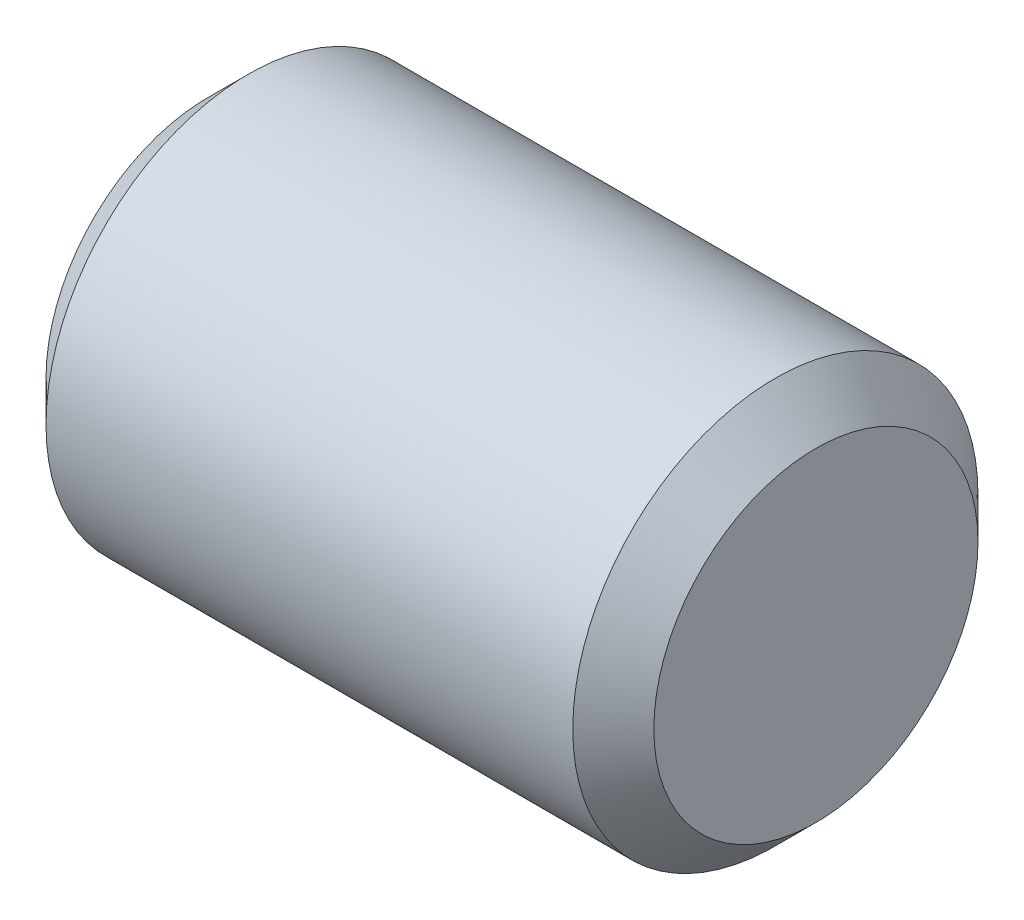
ISO-10303-21;
HEADER;
FILE_DESCRIPTION(('STEP AP214'),'2;1');
FILE_NAME('part.step','',(''),(''),'','','');
FILE_SCHEMA(('AUTOMOTIVE_DESIGN { 1 0 10303 214 1 1 1 1 }'));
ENDSEC;
DATA;
#1=APPLICATION_CONTEXT('core data for automotive mechanical design processes');
#2=APPLICATION_PROTOCOL_DEFINITION('international standard','automotive_design',2000,#1);
#3=PRODUCT_CONTEXT('',#1,'mechanical');
#4=PRODUCT('Part','Part','',(#3));
#5=PRODUCT_RELATED_PRODUCT_CATEGORY('part','',(#4));
#6=PRODUCT_DEFINITION_FORMATION('','',#4);
#7=PRODUCT_DEFINITION_CONTEXT('part definition',#1,'design');
#8=PRODUCT_DEFINITION('design','',#6,#7);
#9=PRODUCT_DEFINITION_SHAPE('','',#8);
#10=(LENGTH_UNIT() NAMED_UNIT(*) SI_UNIT(.MILLI.,.METRE.));
#11=(NAMED_UNIT(*) PLANE_ANGLE_UNIT() SI_UNIT($,.RADIAN.));
#12=(NAMED_UNIT(*) SI_UNIT($,.STERADIAN.) SOLID_ANGLE_UNIT());
#13=UNCERTAINTY_MEASURE_WITH_UNIT(LENGTH_MEASURE(1.E-05),#10,'distance_accuracy_value','');
#14=(GEOMETRIC_REPRESENTATION_CONTEXT(3) GLOBAL_UNCERTAINTY_ASSIGNED_CONTEXT((#13)) GLOBAL_UNIT_ASSIGNED_CONTEXT((#10,
#11,#12)) REPRESENTATION_CONTEXT('',''));
#15=CARTESIAN_POINT('',(0.,0.,0.));
#16=DIRECTION('',(0.,0.,1.));
#17=DIRECTION('',(1.,0.,0.));
#18=AXIS2_PLACEMENT_3D('',#15,#16,#17);
#19=CARTESIAN_POINT('',(-4.7625,0.,0.));
#20=DIRECTION('',(1.,0.,0.));
#21=DIRECTION('',(0.,0.,-1.));
#22=AXIS2_PLACEMENT_3D('',#19,#20,#21);
#23=CYLINDRICAL_SURFACE('',#22,3.175);
#24=CARTESIAN_POINT('',(4.1275,0.,0.));
#25=DIRECTION('',(1.,0.,0.));
#26=DIRECTION('',(0.,0.,-1.));
#27=AXIS2_PLACEMENT_3D('',#24,#25,#26);
#28=CIRCLE('',#27,3.175);
#29=CARTESIAN_POINT('',(4.1275,0.,-3.175));
#30=VERTEX_POINT('',#29);
#31=EDGE_CURVE('E37',#30,#30,#28,.F.);
#32=ORIENTED_EDGE('',*,*,#31,.T.);
#33=EDGE_LOOP('',(#32));
#34=FACE_BOUND('',#33,.T.);
#35=CARTESIAN_POINT('',(-4.1275,0.,0.));
#36=DIRECTION('',(1.,0.,0.));
#37=DIRECTION('',(0.,0.,-1.));
#38=AXIS2_PLACEMENT_3D('',#35,#36,#37);
#39=CIRCLE('',#38,3.175);
#40=CARTESIAN_POINT('',(-4.1275,0.,-3.175));
#41=VERTEX_POINT('',#40);
#42=EDGE_CURVE('E41',#41,#41,#39,.T.);
#43=ORIENTED_EDGE('',*,*,#42,.T.);
#44=EDGE_LOOP('',(#43));
#45=FACE_BOUND('',#44,.T.);
#46=ADVANCED_FACE('F30',(#34,#45),#23,.T.);
#47=CARTESIAN_POINT('',(-4.7625,0.,0.));
#48=DIRECTION('',(1.,0.,0.));
#49=DIRECTION('',(0.,0.,-1.));
#50=AXIS2_PLACEMENT_3D('',#47,#48,#49);
#51=PLANE('',#50);
#52=CARTESIAN_POINT('',(-4.7625,0.,0.));
#53=DIRECTION('',(1.,0.,0.));
#54=DIRECTION('',(0.,0.,-1.));
#55=AXIS2_PLACEMENT_3D('',#52,#53,#54);
#56=CIRCLE('',#55,2.54);
#57=CARTESIAN_POINT('',(-4.7625,0.,-2.54));
#58=VERTEX_POINT('',#57);
#59=EDGE_CURVE('E10',#58,#58,#56,.F.);
#60=ORIENTED_EDGE('',*,*,#59,.T.);
#61=EDGE_LOOP('',(#60));
#62=FACE_BOUND('',#61,.T.);
#63=ADVANCED_FACE('F61',(#62),#51,.F.);
#64=CARTESIAN_POINT('',(4.7625,0.,0.));
#65=DIRECTION('',(1.,0.,0.));
#66=DIRECTION('',(0.,0.,-1.));
#67=AXIS2_PLACEMENT_3D('',#64,#65,#66);
#68=PLANE('',#67);
#69=CARTESIAN_POINT('',(4.7625,0.,0.));
#70=DIRECTION('',(1.,0.,0.));
#71=DIRECTION('',(0.,0.,-1.));
#72=AXIS2_PLACEMENT_3D('',#69,#70,#71);
#73=CIRCLE('',#72,2.54);
#74=CARTESIAN_POINT('',(4.7625,0.,-2.54));
#75=VERTEX_POINT('',#74);
#76=EDGE_CURVE('E45',#75,#75,#73,.T.);
#77=ORIENTED_EDGE('',*,*,#76,.T.);
#78=EDGE_LOOP('',(#77));
#79=FACE_BOUND('',#78,.T.);
#80=ADVANCED_FACE('F51',(#79),#68,.T.);
#81=CARTESIAN_POINT('',(4.7625,0.,0.));
#82=DIRECTION('',(-1.,0.,0.));
#83=DIRECTION('',(0.,0.,1.));
#84=AXIS2_PLACEMENT_3D('',#81,#82,#83);
#85=CONICAL_SURFACE('',#84,2.54,0.785398163397448);
#86=ORIENTED_EDGE('',*,*,#31,.F.);
#87=EDGE_LOOP('',(#86));
#88=FACE_BOUND('',#87,.T.);
#89=ORIENTED_EDGE('',*,*,#76,.F.);
#90=EDGE_LOOP('',(#89));
#91=FACE_BOUND('',#90,.T.);
#92=ADVANCED_FACE('F53',(#88,#91),#85,.T.);
#93=CARTESIAN_POINT('',(-4.1275,0.,0.));
#94=DIRECTION('',(1.,0.,0.));
#95=DIRECTION('',(0.,0.,-1.));
#96=AXIS2_PLACEMENT_3D('',#93,#94,#95);
#97=CONICAL_SURFACE('',#96,3.175,0.78539816339745);
#98=ORIENTED_EDGE('',*,*,#59,.F.);
#99=EDGE_LOOP('',(#98));
#100=FACE_BOUND('',#99,.T.);
#101=ORIENTED_EDGE('',*,*,#42,.F.);
#102=EDGE_LOOP('',(#101));
#103=FACE_BOUND('',#102,.T.);
#104=ADVANCED_FACE('F32',(#100,#103),#97,.T.);
#105=CLOSED_SHELL('',(#46,#63,#80,#92,#104));
#106=MANIFOLD_SOLID_BREP('B2',#105);
#107=ADVANCED_BREP_SHAPE_REPRESENTATION('',(#18,#106),#14);
#108=SHAPE_DEFINITION_REPRESENTATION(#9,#107);
ENDSEC;
END-ISO-10303-21;
